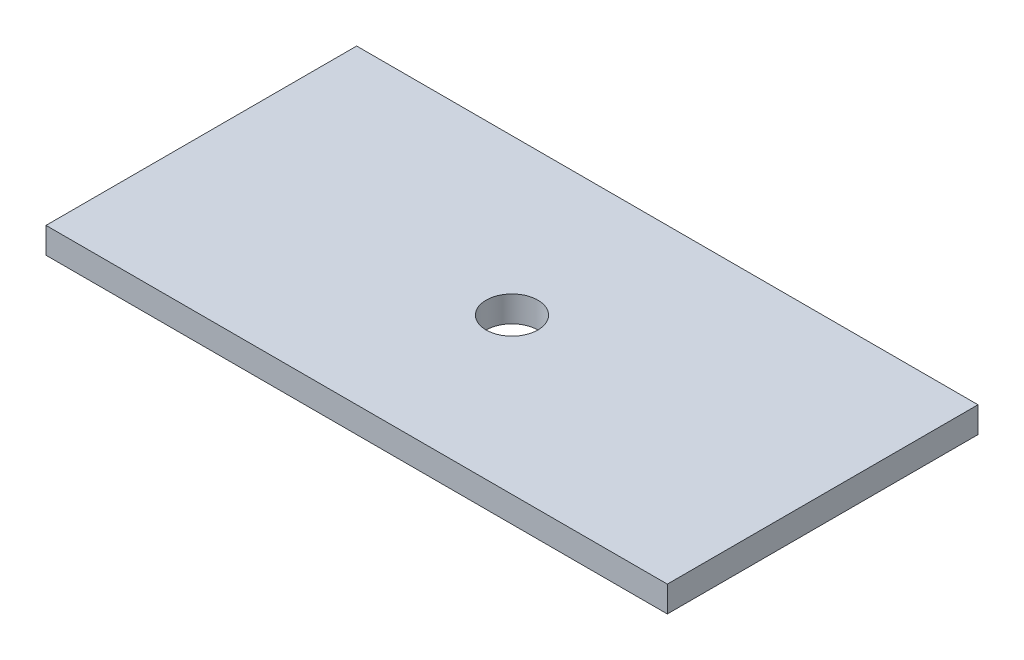
ISO-10303-21;
HEADER;
FILE_DESCRIPTION(('STEP AP214'),'2;1');
FILE_NAME('part.step','',(''),(''),'','','');
FILE_SCHEMA(('AUTOMOTIVE_DESIGN { 1 0 10303 214 1 1 1 1 }'));
ENDSEC;
DATA;
#1=APPLICATION_CONTEXT('core data for automotive mechanical design processes');
#2=APPLICATION_PROTOCOL_DEFINITION('international standard','automotive_design',2000,#1);
#3=PRODUCT_CONTEXT('',#1,'mechanical');
#4=PRODUCT('Part','Part','',(#3));
#5=PRODUCT_RELATED_PRODUCT_CATEGORY('part','',(#4));
#6=PRODUCT_DEFINITION_FORMATION('','',#4);
#7=PRODUCT_DEFINITION_CONTEXT('part definition',#1,'design');
#8=PRODUCT_DEFINITION('design','',#6,#7);
#9=PRODUCT_DEFINITION_SHAPE('','',#8);
#10=(LENGTH_UNIT() NAMED_UNIT(*) SI_UNIT(.MILLI.,.METRE.));
#11=(NAMED_UNIT(*) PLANE_ANGLE_UNIT() SI_UNIT($,.RADIAN.));
#12=(NAMED_UNIT(*) SI_UNIT($,.STERADIAN.) SOLID_ANGLE_UNIT());
#13=UNCERTAINTY_MEASURE_WITH_UNIT(LENGTH_MEASURE(1.E-05),#10,'distance_accuracy_value','');
#14=(GEOMETRIC_REPRESENTATION_CONTEXT(3) GLOBAL_UNCERTAINTY_ASSIGNED_CONTEXT((#13)) GLOBAL_UNIT_ASSIGNED_CONTEXT((#10,
#11,#12)) REPRESENTATION_CONTEXT('',''));
#15=CARTESIAN_POINT('',(0.,0.,0.));
#16=DIRECTION('',(0.,0.,1.));
#17=DIRECTION('',(1.,0.,0.));
#18=AXIS2_PLACEMENT_3D('',#15,#16,#17);
#19=CARTESIAN_POINT('',(0.,6.35,0.));
#20=DIRECTION('',(0.,-1.,0.));
#21=DIRECTION('',(0.,0.,-1.));
#22=AXIS2_PLACEMENT_3D('',#19,#20,#21);
#23=PLANE('',#22);
#24=DIRECTION('',(0.,0.,-1.));
#25=VECTOR('',#24,1.);
#26=CARTESIAN_POINT('',(76.2,6.35,38.1));
#27=LINE('',#26,#25);
#28=CARTESIAN_POINT('',(76.2,6.35,38.1));
#29=VERTEX_POINT('',#28);
#30=CARTESIAN_POINT('',(76.2,6.35,-38.1));
#31=VERTEX_POINT('',#30);
#32=EDGE_CURVE('E92',#29,#31,#27,.T.);
#33=ORIENTED_EDGE('',*,*,#32,.T.);
#34=DIRECTION('',(-1.,0.,0.));
#35=VECTOR('',#34,1.);
#36=CARTESIAN_POINT('',(-76.2,6.35,-38.1));
#37=LINE('',#36,#35);
#38=CARTESIAN_POINT('',(-76.2,6.35,-38.1));
#39=VERTEX_POINT('',#38);
#40=EDGE_CURVE('E87',#31,#39,#37,.T.);
#41=ORIENTED_EDGE('',*,*,#40,.T.);
#42=DIRECTION('',(0.,0.,1.));
#43=VECTOR('',#42,1.);
#44=CARTESIAN_POINT('',(-76.2,6.35,38.1));
#45=LINE('',#44,#43);
#46=CARTESIAN_POINT('',(-76.2,6.35,38.1));
#47=VERTEX_POINT('',#46);
#48=EDGE_CURVE('E90',#39,#47,#45,.T.);
#49=ORIENTED_EDGE('',*,*,#48,.T.);
#50=DIRECTION('',(1.,0.,0.));
#51=VECTOR('',#50,1.);
#52=CARTESIAN_POINT('',(-76.2,6.35,38.1));
#53=LINE('',#52,#51);
#54=EDGE_CURVE('E57',#47,#29,#53,.T.);
#55=ORIENTED_EDGE('',*,*,#54,.T.);
#56=EDGE_LOOP('',(#33,#41,#49,#55));
#57=FACE_BOUND('',#56,.T.);
#58=CARTESIAN_POINT('',(0.,6.35,0.));
#59=DIRECTION('',(0.,1.,0.));
#60=DIRECTION('',(0.,0.,1.));
#61=AXIS2_PLACEMENT_3D('',#58,#59,#60);
#62=CIRCLE('',#61,6.35);
#63=CARTESIAN_POINT('',(0.,6.35,6.34999999999999));
#64=VERTEX_POINT('',#63);
#65=EDGE_CURVE('E112',#64,#64,#62,.T.);
#66=ORIENTED_EDGE('',*,*,#65,.F.);
#67=EDGE_LOOP('',(#66));
#68=FACE_BOUND('',#67,.T.);
#69=ADVANCED_FACE('F39',(#57,#68),#23,.F.);
#70=CARTESIAN_POINT('',(0.,0.,0.));
#71=DIRECTION('',(0.,-1.,0.));
#72=DIRECTION('',(0.,0.,-1.));
#73=AXIS2_PLACEMENT_3D('',#70,#71,#72);
#74=PLANE('',#73);
#75=DIRECTION('',(0.,0.,-1.));
#76=VECTOR('',#75,1.);
#77=CARTESIAN_POINT('',(76.2,0.,38.1));
#78=LINE('',#77,#76);
#79=CARTESIAN_POINT('',(76.2,0.,38.1));
#80=VERTEX_POINT('',#79);
#81=CARTESIAN_POINT('',(76.2,0.,-38.1));
#82=VERTEX_POINT('',#81);
#83=EDGE_CURVE('E108',#80,#82,#78,.T.);
#84=ORIENTED_EDGE('',*,*,#83,.F.);
#85=DIRECTION('',(1.,0.,0.));
#86=VECTOR('',#85,1.);
#87=CARTESIAN_POINT('',(-76.2,0.,38.1));
#88=LINE('',#87,#86);
#89=CARTESIAN_POINT('',(-76.2,0.,38.1));
#90=VERTEX_POINT('',#89);
#91=EDGE_CURVE('E80',#90,#80,#88,.T.);
#92=ORIENTED_EDGE('',*,*,#91,.F.);
#93=DIRECTION('',(0.,0.,1.));
#94=VECTOR('',#93,1.);
#95=CARTESIAN_POINT('',(-76.2,0.,38.1));
#96=LINE('',#95,#94);
#97=CARTESIAN_POINT('',(-76.2,0.,-38.1));
#98=VERTEX_POINT('',#97);
#99=EDGE_CURVE('E74',#98,#90,#96,.T.);
#100=ORIENTED_EDGE('',*,*,#99,.F.);
#101=DIRECTION('',(-1.,0.,0.));
#102=VECTOR('',#101,1.);
#103=CARTESIAN_POINT('',(-76.2,0.,-38.1));
#104=LINE('',#103,#102);
#105=EDGE_CURVE('E97',#82,#98,#104,.T.);
#106=ORIENTED_EDGE('',*,*,#105,.F.);
#107=EDGE_LOOP('',(#84,#92,#100,#106));
#108=FACE_BOUND('',#107,.T.);
#109=CARTESIAN_POINT('',(0.,0.,0.));
#110=DIRECTION('',(0.,1.,0.));
#111=DIRECTION('',(0.,0.,1.));
#112=AXIS2_PLACEMENT_3D('',#109,#110,#111);
#113=CIRCLE('',#112,6.35);
#114=CARTESIAN_POINT('',(0.,0.,6.34999999999999));
#115=VERTEX_POINT('',#114);
#116=EDGE_CURVE('E130',#115,#115,#113,.T.);
#117=ORIENTED_EDGE('',*,*,#116,.T.);
#118=EDGE_LOOP('',(#117));
#119=FACE_BOUND('',#118,.T.);
#120=ADVANCED_FACE('F125',(#108,#119),#74,.T.);
#121=CARTESIAN_POINT('',(76.2,6.35,38.1));
#122=DIRECTION('',(-1.,0.,0.));
#123=DIRECTION('',(0.,0.,1.));
#124=AXIS2_PLACEMENT_3D('',#121,#122,#123);
#125=PLANE('',#124);
#126=ORIENTED_EDGE('',*,*,#83,.T.);
#127=DIRECTION('',(0.,-1.,0.));
#128=VECTOR('',#127,1.);
#129=CARTESIAN_POINT('',(76.2,6.35,-38.1));
#130=LINE('',#129,#128);
#131=EDGE_CURVE('E11',#31,#82,#130,.T.);
#132=ORIENTED_EDGE('',*,*,#131,.F.);
#133=ORIENTED_EDGE('',*,*,#32,.F.);
#134=DIRECTION('',(0.,-1.,0.));
#135=VECTOR('',#134,1.);
#136=CARTESIAN_POINT('',(76.2,6.35,38.1));
#137=LINE('',#136,#135);
#138=EDGE_CURVE('E104',#29,#80,#137,.T.);
#139=ORIENTED_EDGE('',*,*,#138,.T.);
#140=EDGE_LOOP('',(#126,#132,#133,#139));
#141=FACE_BOUND('',#140,.T.);
#142=ADVANCED_FACE('F41',(#141),#125,.F.);
#143=CARTESIAN_POINT('',(-76.2,6.35,-38.1));
#144=DIRECTION('',(0.,0.,1.));
#145=DIRECTION('',(1.,0.,0.));
#146=AXIS2_PLACEMENT_3D('',#143,#144,#145);
#147=PLANE('',#146);
#148=ORIENTED_EDGE('',*,*,#105,.T.);
#149=DIRECTION('',(0.,-1.,0.));
#150=VECTOR('',#149,1.);
#151=CARTESIAN_POINT('',(-76.2,6.35,-38.1));
#152=LINE('',#151,#150);
#153=EDGE_CURVE('E49',#39,#98,#152,.T.);
#154=ORIENTED_EDGE('',*,*,#153,.F.);
#155=ORIENTED_EDGE('',*,*,#40,.F.);
#156=ORIENTED_EDGE('',*,*,#131,.T.);
#157=EDGE_LOOP('',(#148,#154,#155,#156));
#158=FACE_BOUND('',#157,.T.);
#159=ADVANCED_FACE('F96',(#158),#147,.F.);
#160=CARTESIAN_POINT('',(-76.2,6.35,38.1));
#161=DIRECTION('',(1.,0.,0.));
#162=DIRECTION('',(0.,0.,-1.));
#163=AXIS2_PLACEMENT_3D('',#160,#161,#162);
#164=PLANE('',#163);
#165=ORIENTED_EDGE('',*,*,#99,.T.);
#166=DIRECTION('',(0.,-1.,0.));
#167=VECTOR('',#166,1.);
#168=CARTESIAN_POINT('',(-76.2,6.35,38.1));
#169=LINE('',#168,#167);
#170=EDGE_CURVE('E99',#47,#90,#169,.T.);
#171=ORIENTED_EDGE('',*,*,#170,.F.);
#172=ORIENTED_EDGE('',*,*,#48,.F.);
#173=ORIENTED_EDGE('',*,*,#153,.T.);
#174=EDGE_LOOP('',(#165,#171,#172,#173));
#175=FACE_BOUND('',#174,.T.);
#176=ADVANCED_FACE('F100',(#175),#164,.F.);
#177=CARTESIAN_POINT('',(-76.2,6.35,38.1));
#178=DIRECTION('',(0.,0.,-1.));
#179=DIRECTION('',(-1.,0.,0.));
#180=AXIS2_PLACEMENT_3D('',#177,#178,#179);
#181=PLANE('',#180);
#182=ORIENTED_EDGE('',*,*,#91,.T.);
#183=ORIENTED_EDGE('',*,*,#138,.F.);
#184=ORIENTED_EDGE('',*,*,#54,.F.);
#185=ORIENTED_EDGE('',*,*,#170,.T.);
#186=EDGE_LOOP('',(#182,#183,#184,#185));
#187=FACE_BOUND('',#186,.T.);
#188=ADVANCED_FACE('F122',(#187),#181,.F.);
#189=CARTESIAN_POINT('',(0.,6.35,0.));
#190=DIRECTION('',(0.,-1.,0.));
#191=DIRECTION('',(0.,0.,-1.));
#192=AXIS2_PLACEMENT_3D('',#189,#190,#191);
#193=CYLINDRICAL_SURFACE('',#192,6.35);
#194=ORIENTED_EDGE('',*,*,#65,.T.);
#195=EDGE_LOOP('',(#194));
#196=FACE_BOUND('',#195,.T.);
#197=ORIENTED_EDGE('',*,*,#116,.F.);
#198=EDGE_LOOP('',(#197));
#199=FACE_BOUND('',#198,.T.);
#200=ADVANCED_FACE('F138',(#196,#199),#193,.F.);
#201=CLOSED_SHELL('',(#69,#120,#142,#159,#176,#188,#200));
#202=MANIFOLD_SOLID_BREP('B2',#201);
#203=ADVANCED_BREP_SHAPE_REPRESENTATION('',(#18,#202),#14);
#204=SHAPE_DEFINITION_REPRESENTATION(#9,#203);
ENDSEC;
END-ISO-10303-21;
